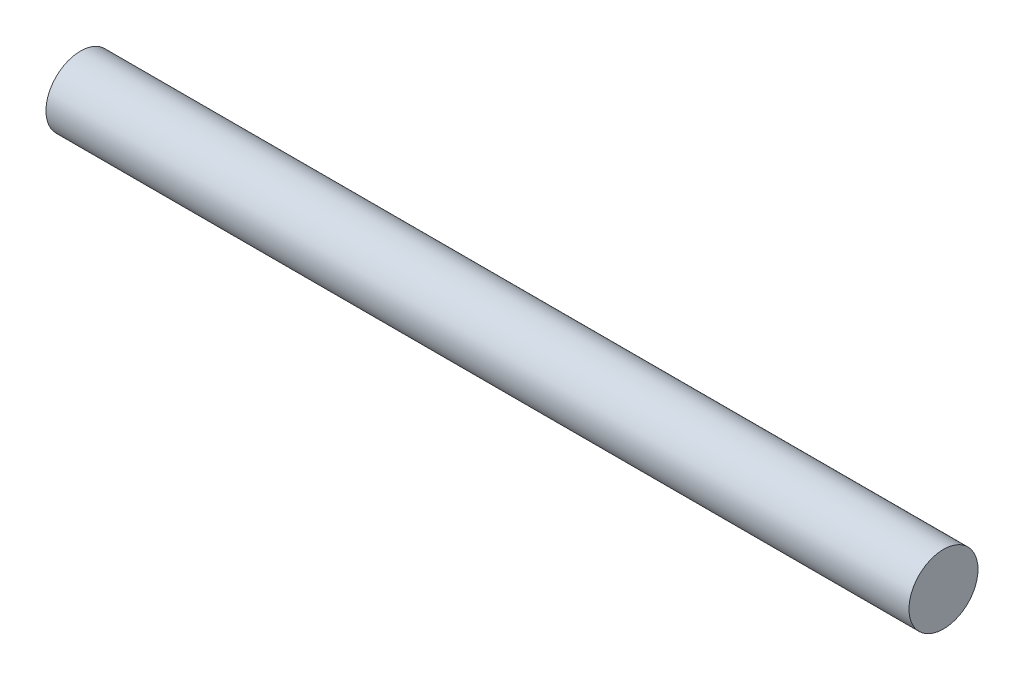
ISO-10303-21;
HEADER;
FILE_DESCRIPTION(('STEP AP214'),'2;1');
FILE_NAME('part.step','',(''),(''),'','','');
FILE_SCHEMA(('AUTOMOTIVE_DESIGN { 1 0 10303 214 1 1 1 1 }'));
ENDSEC;
DATA;
#1=APPLICATION_CONTEXT('core data for automotive mechanical design processes');
#2=APPLICATION_PROTOCOL_DEFINITION('international standard','automotive_design',2000,#1);
#3=PRODUCT_CONTEXT('',#1,'mechanical');
#4=PRODUCT('Part','Part','',(#3));
#5=PRODUCT_RELATED_PRODUCT_CATEGORY('part','',(#4));
#6=PRODUCT_DEFINITION_FORMATION('','',#4);
#7=PRODUCT_DEFINITION_CONTEXT('part definition',#1,'design');
#8=PRODUCT_DEFINITION('design','',#6,#7);
#9=PRODUCT_DEFINITION_SHAPE('','',#8);
#10=(LENGTH_UNIT() NAMED_UNIT(*) SI_UNIT(.MILLI.,.METRE.));
#11=(NAMED_UNIT(*) PLANE_ANGLE_UNIT() SI_UNIT($,.RADIAN.));
#12=(NAMED_UNIT(*) SI_UNIT($,.STERADIAN.) SOLID_ANGLE_UNIT());
#13=UNCERTAINTY_MEASURE_WITH_UNIT(LENGTH_MEASURE(1.E-05),#10,'distance_accuracy_value','');
#14=(GEOMETRIC_REPRESENTATION_CONTEXT(3) GLOBAL_UNCERTAINTY_ASSIGNED_CONTEXT((#13)) GLOBAL_UNIT_ASSIGNED_CONTEXT((#10,
#11,#12)) REPRESENTATION_CONTEXT('',''));
#15=CARTESIAN_POINT('',(0.,0.,0.));
#16=DIRECTION('',(0.,0.,1.));
#17=DIRECTION('',(1.,0.,0.));
#18=AXIS2_PLACEMENT_3D('',#15,#16,#17);
#19=CARTESIAN_POINT('',(72.,0.,0.));
#20=DIRECTION('',(-1.,0.,0.));
#21=DIRECTION('',(0.,0.,1.));
#22=AXIS2_PLACEMENT_3D('',#19,#20,#21);
#23=CYLINDRICAL_SURFACE('',#22,2.88);
#24=CARTESIAN_POINT('',(72.,0.,0.));
#25=DIRECTION('',(1.,0.,0.));
#26=DIRECTION('',(0.,0.,-1.));
#27=AXIS2_PLACEMENT_3D('',#24,#25,#26);
#28=CIRCLE('',#27,2.88);
#29=CARTESIAN_POINT('',(72.,0.,-2.88));
#30=VERTEX_POINT('',#29);
#31=EDGE_CURVE('E10',#30,#30,#28,.T.);
#32=ORIENTED_EDGE('',*,*,#31,.F.);
#33=EDGE_LOOP('',(#32));
#34=FACE_BOUND('',#33,.T.);
#35=CARTESIAN_POINT('',(0.,0.,0.));
#36=DIRECTION('',(1.,0.,0.));
#37=DIRECTION('',(0.,0.,-1.));
#38=AXIS2_PLACEMENT_3D('',#35,#36,#37);
#39=CIRCLE('',#38,2.88);
#40=CARTESIAN_POINT('',(0.,0.,-2.88));
#41=VERTEX_POINT('',#40);
#42=EDGE_CURVE('E34',#41,#41,#39,.T.);
#43=ORIENTED_EDGE('',*,*,#42,.T.);
#44=EDGE_LOOP('',(#43));
#45=FACE_BOUND('',#44,.T.);
#46=ADVANCED_FACE('F31',(#34,#45),#23,.T.);
#47=CARTESIAN_POINT('',(72.,0.,0.));
#48=DIRECTION('',(1.,0.,0.));
#49=DIRECTION('',(0.,0.,-1.));
#50=AXIS2_PLACEMENT_3D('',#47,#48,#49);
#51=PLANE('',#50);
#52=ORIENTED_EDGE('',*,*,#31,.T.);
#53=EDGE_LOOP('',(#52));
#54=FACE_BOUND('',#53,.T.);
#55=ADVANCED_FACE('F46',(#54),#51,.T.);
#56=CARTESIAN_POINT('',(0.,0.,0.));
#57=DIRECTION('',(1.,0.,0.));
#58=DIRECTION('',(0.,0.,-1.));
#59=AXIS2_PLACEMENT_3D('',#56,#57,#58);
#60=PLANE('',#59);
#61=ORIENTED_EDGE('',*,*,#42,.F.);
#62=EDGE_LOOP('',(#61));
#63=FACE_BOUND('',#62,.T.);
#64=ADVANCED_FACE('F44',(#63),#60,.F.);
#65=CLOSED_SHELL('',(#46,#55,#64));
#66=MANIFOLD_SOLID_BREP('B2',#65);
#67=ADVANCED_BREP_SHAPE_REPRESENTATION('',(#18,#66),#14);
#68=SHAPE_DEFINITION_REPRESENTATION(#9,#67);
ENDSEC;
END-ISO-10303-21;
